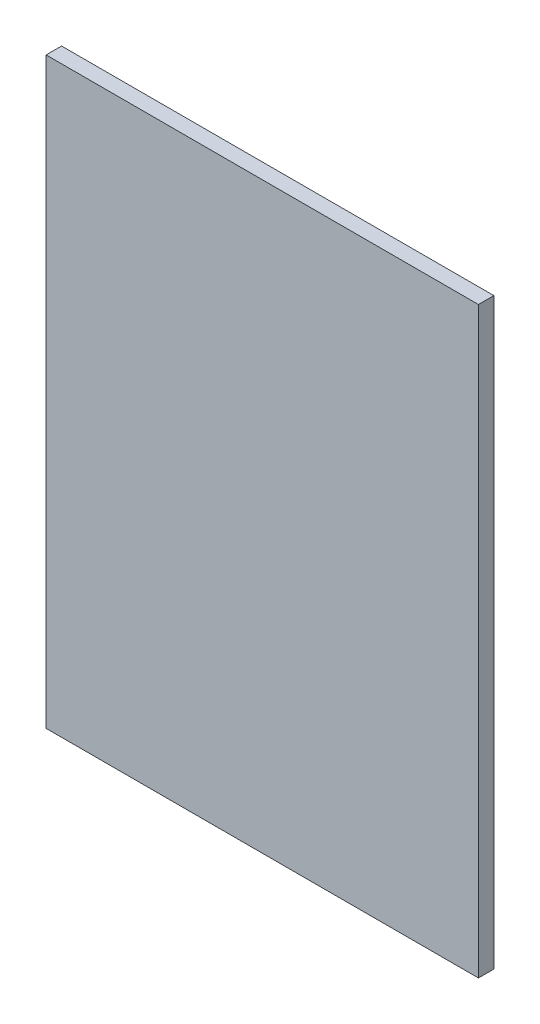
ISO-10303-21;
HEADER;
FILE_DESCRIPTION(('STEP AP214'),'2;1');
FILE_NAME('part.step','',(''),(''),'','','');
FILE_SCHEMA(('AUTOMOTIVE_DESIGN { 1 0 10303 214 1 1 1 1 }'));
ENDSEC;
DATA;
#1=APPLICATION_CONTEXT('core data for automotive mechanical design processes');
#2=APPLICATION_PROTOCOL_DEFINITION('international standard','automotive_design',2000,#1);
#3=PRODUCT_CONTEXT('',#1,'mechanical');
#4=PRODUCT('Part','Part','',(#3));
#5=PRODUCT_RELATED_PRODUCT_CATEGORY('part','',(#4));
#6=PRODUCT_DEFINITION_FORMATION('','',#4);
#7=PRODUCT_DEFINITION_CONTEXT('part definition',#1,'design');
#8=PRODUCT_DEFINITION('design','',#6,#7);
#9=PRODUCT_DEFINITION_SHAPE('','',#8);
#10=(LENGTH_UNIT() NAMED_UNIT(*) SI_UNIT(.MILLI.,.METRE.));
#11=(NAMED_UNIT(*) PLANE_ANGLE_UNIT() SI_UNIT($,.RADIAN.));
#12=(NAMED_UNIT(*) SI_UNIT($,.STERADIAN.) SOLID_ANGLE_UNIT());
#13=UNCERTAINTY_MEASURE_WITH_UNIT(LENGTH_MEASURE(1.E-05),#10,'distance_accuracy_value','');
#14=(GEOMETRIC_REPRESENTATION_CONTEXT(3) GLOBAL_UNCERTAINTY_ASSIGNED_CONTEXT((#13)) GLOBAL_UNIT_ASSIGNED_CONTEXT((#10,
#11,#12)) REPRESENTATION_CONTEXT('',''));
#15=CARTESIAN_POINT('',(0.,0.,0.));
#16=DIRECTION('',(0.,0.,1.));
#17=DIRECTION('',(1.,0.,0.));
#18=AXIS2_PLACEMENT_3D('',#15,#16,#17);
#19=CARTESIAN_POINT('',(-63.,85.,4.5));
#20=DIRECTION('',(0.,1.,0.));
#21=DIRECTION('',(0.,0.,1.));
#22=AXIS2_PLACEMENT_3D('',#19,#20,#21);
#23=PLANE('',#22);
#24=DIRECTION('',(1.,0.,0.));
#25=VECTOR('',#24,1.);
#26=CARTESIAN_POINT('',(-63.,85.,0.));
#27=LINE('',#26,#25);
#28=CARTESIAN_POINT('',(-63.,85.,0.));
#29=VERTEX_POINT('',#28);
#30=CARTESIAN_POINT('',(63.,85.,0.));
#31=VERTEX_POINT('',#30);
#32=EDGE_CURVE('E109',#29,#31,#27,.T.);
#33=ORIENTED_EDGE('',*,*,#32,.F.);
#34=DIRECTION('',(0.,0.,-1.));
#35=VECTOR('',#34,1.);
#36=CARTESIAN_POINT('',(-63.,85.,4.5));
#37=LINE('',#36,#35);
#38=CARTESIAN_POINT('',(-63.,85.,4.5));
#39=VERTEX_POINT('',#38);
#40=EDGE_CURVE('E12',#39,#29,#37,.T.);
#41=ORIENTED_EDGE('',*,*,#40,.F.);
#42=DIRECTION('',(1.,0.,0.));
#43=VECTOR('',#42,1.);
#44=CARTESIAN_POINT('',(-63.,85.,4.5));
#45=LINE('',#44,#43);
#46=CARTESIAN_POINT('',(63.,85.,4.5));
#47=VERTEX_POINT('',#46);
#48=EDGE_CURVE('E96',#39,#47,#45,.T.);
#49=ORIENTED_EDGE('',*,*,#48,.T.);
#50=DIRECTION('',(0.,0.,-1.));
#51=VECTOR('',#50,1.);
#52=CARTESIAN_POINT('',(63.,85.,4.5));
#53=LINE('',#52,#51);
#54=EDGE_CURVE('E39',#47,#31,#53,.T.);
#55=ORIENTED_EDGE('',*,*,#54,.T.);
#56=EDGE_LOOP('',(#33,#41,#49,#55));
#57=FACE_BOUND('',#56,.T.);
#58=ADVANCED_FACE('F36',(#57),#23,.T.);
#59=CARTESIAN_POINT('',(-63.,-85.,4.5));
#60=DIRECTION('',(-1.,0.,0.));
#61=DIRECTION('',(0.,0.,1.));
#62=AXIS2_PLACEMENT_3D('',#59,#60,#61);
#63=PLANE('',#62);
#64=DIRECTION('',(0.,1.,0.));
#65=VECTOR('',#64,1.);
#66=CARTESIAN_POINT('',(-63.,-85.,0.));
#67=LINE('',#66,#65);
#68=CARTESIAN_POINT('',(-63.,-85.,0.));
#69=VERTEX_POINT('',#68);
#70=EDGE_CURVE('E98',#69,#29,#67,.T.);
#71=ORIENTED_EDGE('',*,*,#70,.F.);
#72=DIRECTION('',(0.,0.,-1.));
#73=VECTOR('',#72,1.);
#74=CARTESIAN_POINT('',(-63.,-85.,4.5));
#75=LINE('',#74,#73);
#76=CARTESIAN_POINT('',(-63.,-85.,4.5));
#77=VERTEX_POINT('',#76);
#78=EDGE_CURVE('E45',#77,#69,#75,.T.);
#79=ORIENTED_EDGE('',*,*,#78,.F.);
#80=DIRECTION('',(0.,1.,0.));
#81=VECTOR('',#80,1.);
#82=CARTESIAN_POINT('',(-63.,-85.,4.5));
#83=LINE('',#82,#81);
#84=EDGE_CURVE('E84',#77,#39,#83,.T.);
#85=ORIENTED_EDGE('',*,*,#84,.T.);
#86=ORIENTED_EDGE('',*,*,#40,.T.);
#87=EDGE_LOOP('',(#71,#79,#85,#86));
#88=FACE_BOUND('',#87,.T.);
#89=ADVANCED_FACE('F119',(#88),#63,.T.);
#90=CARTESIAN_POINT('',(-63.,-85.,4.5));
#91=DIRECTION('',(0.,1.,0.));
#92=DIRECTION('',(0.,0.,1.));
#93=AXIS2_PLACEMENT_3D('',#90,#91,#92);
#94=PLANE('',#93);
#95=DIRECTION('',(1.,0.,0.));
#96=VECTOR('',#95,1.);
#97=CARTESIAN_POINT('',(-63.,-85.,0.));
#98=LINE('',#97,#96);
#99=CARTESIAN_POINT('',(63.,-85.,0.));
#100=VERTEX_POINT('',#99);
#101=EDGE_CURVE('E90',#69,#100,#98,.T.);
#102=ORIENTED_EDGE('',*,*,#101,.T.);
#103=DIRECTION('',(0.,0.,-1.));
#104=VECTOR('',#103,1.);
#105=CARTESIAN_POINT('',(63.,-85.,4.5));
#106=LINE('',#105,#104);
#107=CARTESIAN_POINT('',(63.,-85.,4.5));
#108=VERTEX_POINT('',#107);
#109=EDGE_CURVE('E88',#108,#100,#106,.T.);
#110=ORIENTED_EDGE('',*,*,#109,.F.);
#111=DIRECTION('',(1.,0.,0.));
#112=VECTOR('',#111,1.);
#113=CARTESIAN_POINT('',(-63.,-85.,4.5));
#114=LINE('',#113,#112);
#115=EDGE_CURVE('E81',#77,#108,#114,.T.);
#116=ORIENTED_EDGE('',*,*,#115,.F.);
#117=ORIENTED_EDGE('',*,*,#78,.T.);
#118=EDGE_LOOP('',(#102,#110,#116,#117));
#119=FACE_BOUND('',#118,.T.);
#120=ADVANCED_FACE('F89',(#119),#94,.F.);
#121=CARTESIAN_POINT('',(63.,-85.,4.5));
#122=DIRECTION('',(-1.,0.,0.));
#123=DIRECTION('',(0.,0.,1.));
#124=AXIS2_PLACEMENT_3D('',#121,#122,#123);
#125=PLANE('',#124);
#126=DIRECTION('',(0.,1.,0.));
#127=VECTOR('',#126,1.);
#128=CARTESIAN_POINT('',(63.,-85.,0.));
#129=LINE('',#128,#127);
#130=EDGE_CURVE('E112',#100,#31,#129,.T.);
#131=ORIENTED_EDGE('',*,*,#130,.T.);
#132=ORIENTED_EDGE('',*,*,#54,.F.);
#133=DIRECTION('',(0.,1.,0.));
#134=VECTOR('',#133,1.);
#135=CARTESIAN_POINT('',(63.,-85.,4.5));
#136=LINE('',#135,#134);
#137=EDGE_CURVE('E78',#108,#47,#136,.T.);
#138=ORIENTED_EDGE('',*,*,#137,.F.);
#139=ORIENTED_EDGE('',*,*,#109,.T.);
#140=EDGE_LOOP('',(#131,#132,#138,#139));
#141=FACE_BOUND('',#140,.T.);
#142=ADVANCED_FACE('F94',(#141),#125,.F.);
#143=CARTESIAN_POINT('',(0.,0.,4.5));
#144=DIRECTION('',(0.,0.,1.));
#145=DIRECTION('',(1.,0.,0.));
#146=AXIS2_PLACEMENT_3D('',#143,#144,#145);
#147=PLANE('',#146);
#148=ORIENTED_EDGE('',*,*,#48,.F.);
#149=ORIENTED_EDGE('',*,*,#84,.F.);
#150=ORIENTED_EDGE('',*,*,#115,.T.);
#151=ORIENTED_EDGE('',*,*,#137,.T.);
#152=EDGE_LOOP('',(#148,#149,#150,#151));
#153=FACE_BOUND('',#152,.T.);
#154=ADVANCED_FACE('F83',(#153),#147,.T.);
#155=CARTESIAN_POINT('',(0.,0.,0.));
#156=DIRECTION('',(0.,0.,1.));
#157=DIRECTION('',(1.,0.,0.));
#158=AXIS2_PLACEMENT_3D('',#155,#156,#157);
#159=PLANE('',#158);
#160=ORIENTED_EDGE('',*,*,#32,.T.);
#161=ORIENTED_EDGE('',*,*,#130,.F.);
#162=ORIENTED_EDGE('',*,*,#101,.F.);
#163=ORIENTED_EDGE('',*,*,#70,.T.);
#164=EDGE_LOOP('',(#160,#161,#162,#163));
#165=FACE_BOUND('',#164,.T.);
#166=ADVANCED_FACE('F118',(#165),#159,.F.);
#167=CLOSED_SHELL('',(#58,#89,#120,#142,#154,#166));
#168=MANIFOLD_SOLID_BREP('B2',#167);
#169=ADVANCED_BREP_SHAPE_REPRESENTATION('',(#18,#168),#14);
#170=SHAPE_DEFINITION_REPRESENTATION(#9,#169);
ENDSEC;
END-ISO-10303-21;
